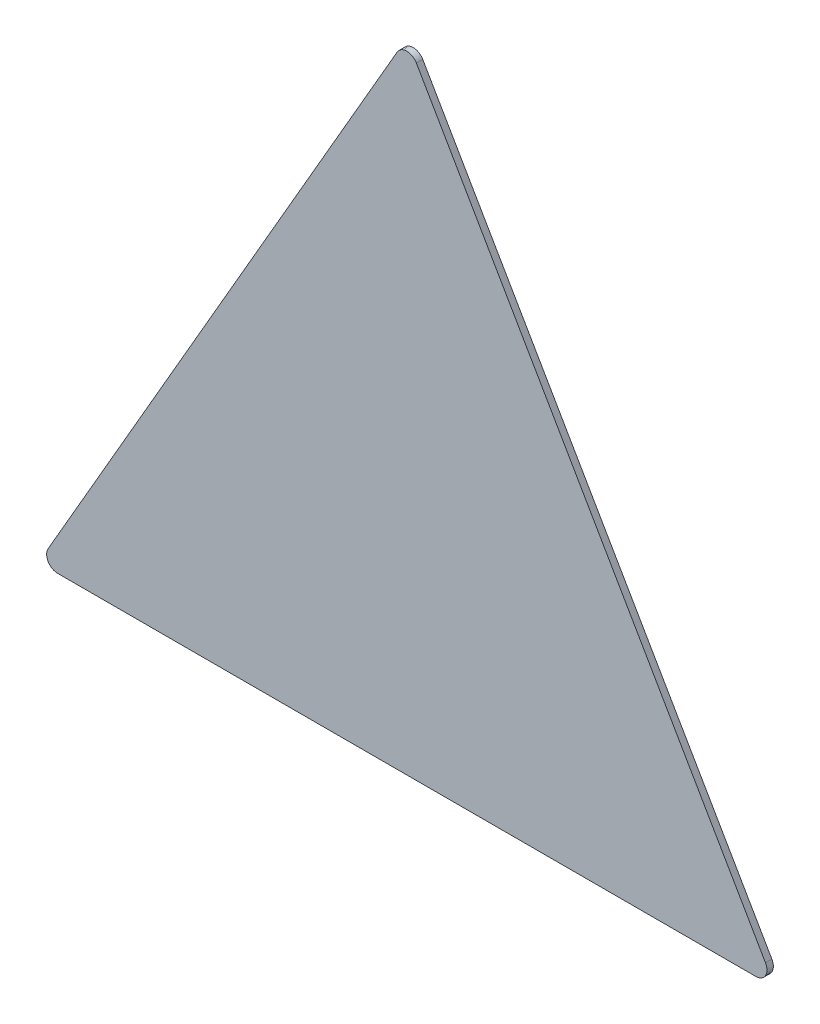
ISO-10303-21;
HEADER;
FILE_DESCRIPTION(('STEP AP214'),'2;1');
FILE_NAME('part.step','',(''),(''),'','','');
FILE_SCHEMA(('AUTOMOTIVE_DESIGN { 1 0 10303 214 1 1 1 1 }'));
ENDSEC;
DATA;
#1=APPLICATION_CONTEXT('core data for automotive mechanical design processes');
#2=APPLICATION_PROTOCOL_DEFINITION('international standard','automotive_design',2000,#1);
#3=PRODUCT_CONTEXT('',#1,'mechanical');
#4=PRODUCT('Part','Part','',(#3));
#5=PRODUCT_RELATED_PRODUCT_CATEGORY('part','',(#4));
#6=PRODUCT_DEFINITION_FORMATION('','',#4);
#7=PRODUCT_DEFINITION_CONTEXT('part definition',#1,'design');
#8=PRODUCT_DEFINITION('design','',#6,#7);
#9=PRODUCT_DEFINITION_SHAPE('','',#8);
#10=(LENGTH_UNIT() NAMED_UNIT(*) SI_UNIT(.MILLI.,.METRE.));
#11=(NAMED_UNIT(*) PLANE_ANGLE_UNIT() SI_UNIT($,.RADIAN.));
#12=(NAMED_UNIT(*) SI_UNIT($,.STERADIAN.) SOLID_ANGLE_UNIT());
#13=UNCERTAINTY_MEASURE_WITH_UNIT(LENGTH_MEASURE(1.E-05),#10,'distance_accuracy_value','');
#14=(GEOMETRIC_REPRESENTATION_CONTEXT(3) GLOBAL_UNCERTAINTY_ASSIGNED_CONTEXT((#13)) GLOBAL_UNIT_ASSIGNED_CONTEXT((#10,
#11,#12)) REPRESENTATION_CONTEXT('',''));
#15=CARTESIAN_POINT('',(0.,0.,0.));
#16=DIRECTION('',(0.,0.,1.));
#17=DIRECTION('',(1.,0.,0.));
#18=AXIS2_PLACEMENT_3D('',#15,#16,#17);
#19=CARTESIAN_POINT('',(103.141629659166,-93.104422444937,1.9));
#20=CARTESIAN_POINT('',(103.178852040873,-93.104422444937,1.9));
#21=CARTESIAN_POINT('',(103.216074422579,-93.104422444937,1.9));
#22=CARTESIAN_POINT('',(103.253291826511,-93.1041447887185,1.9));
#23=CARTESIAN_POINT('',(103.366142188296,-93.1016183909623,1.9));
#24=CARTESIAN_POINT('',(103.478855176732,-93.0914294172124,1.9));
#25=CARTESIAN_POINT('',(103.55423340692,-93.0817370029694,1.9));
#26=CARTESIAN_POINT('',(103.742579830233,-93.0517016000013,1.9));
#27=CARTESIAN_POINT('',(103.928445434177,-93.0109537048063,1.9));
#28=CARTESIAN_POINT('',(104.039054086677,-92.9822226272182,1.9));
#29=CARTESIAN_POINT('',(104.258635544711,-92.9152297759423,1.9));
#30=CARTESIAN_POINT('',(104.471505092383,-92.8282537042299,1.9));
#31=CARTESIAN_POINT('',(104.576539539421,-92.7797256700486,1.9));
#32=CARTESIAN_POINT('',(104.782119906057,-92.6735397423667,1.9));
#33=CARTESIAN_POINT('',(104.977626674108,-92.5500631139336,1.9));
#34=CARTESIAN_POINT('',(105.072620821996,-92.4841386635352,1.9));
#35=CARTESIAN_POINT('',(105.256608972513,-92.3441905683861,1.9));
#36=CARTESIAN_POINT('',(105.427633486552,-92.1885902405563,1.9));
#37=CARTESIAN_POINT('',(105.509695105328,-92.107093417081,1.9));
#38=CARTESIAN_POINT('',(105.666497608147,-91.9371392482291,1.9));
#39=CARTESIAN_POINT('',(105.807819725005,-91.754129630014,1.9));
#40=CARTESIAN_POINT('',(105.874440278277,-91.6596002585276,1.9));
#41=CARTESIAN_POINT('',(105.99925955717,-91.4649709907209,1.9));
#42=CARTESIAN_POINT('',(106.106553546095,-91.2601578730944,1.9));
#43=CARTESIAN_POINT('',(106.155695658159,-91.1554718891076,1.9));
#44=CARTESIAN_POINT('',(106.244722997683,-90.9420741453501,1.9));
#45=CARTESIAN_POINT('',(106.314742328373,-90.7216909991505,1.9));
#46=CARTESIAN_POINT('',(106.344915956849,-90.6100424727091,1.9));
#47=CARTESIAN_POINT('',(106.395423070742,-90.3844103076811,1.9));
#48=CARTESIAN_POINT('',(106.425913759874,-90.1552655074384,1.9));
#49=CARTESIAN_POINT('',(106.436155124557,-90.0400916614831,1.9));
#50=CARTESIAN_POINT('',(106.446630146773,-89.809094503844,1.9));
#51=CARTESIAN_POINT('',(106.437090259918,-89.5779052666268,1.9));
#52=CARTESIAN_POINT('',(106.42724369564,-89.4626212558664,1.9));
#53=CARTESIAN_POINT('',(106.397251538212,-89.2333917055278,1.9));
#54=CARTESIAN_POINT('',(106.346369748708,-89.0082736085243,1.9));
#55=CARTESIAN_POINT('',(106.316149398419,-88.896786507782,1.9));
#56=CARTESIAN_POINT('',(106.258554642843,-88.7128347268528,1.9));
#57=CARTESIAN_POINT('',(106.190144469002,-88.5321054920635,1.9));
#58=CARTESIAN_POINT('',(106.16058715988,-88.4607327796672,1.9));
#59=CARTESIAN_POINT('',(106.112267177822,-88.3556572445573,1.9));
#60=CARTESIAN_POINT('',(106.056929929708,-88.2544646014827,1.9));
#61=CARTESIAN_POINT('',(106.037964382852,-88.22102134209,1.9));
#62=CARTESIAN_POINT('',(106.018738937252,-88.1877218935135,1.9));
#63=CARTESIAN_POINT('',(105.999013491653,-88.1535564195332,1.9));
#64=CARTESIAN_POINT('',(105.998513491653,-88.1526903941294,1.9));
#65=CARTESIAN_POINT('',(105.998013491653,-88.1518243687256,1.9));
#66=CARTESIAN_POINT('',(105.997513491653,-88.1509583433218,1.9));
#67=CARTESIAN_POINT('',(105.997013491653,-88.1500923179181,1.9));
#68=B_SPLINE_CURVE_WITH_KNOTS('',5,(#19,#20,#21,#22,#23,#24,#25,#26,#27,#28,#29,#30,#31,#32,#33,
#34,#35,#36,#37,#38,#39,#40,#41,#42,#43,#44,#45,#46,#47,#48,#49,#50,#51,#52,#53,#54,#55,#56,#57,
#58,#59,#60,#61,#62,#63,#64,#65,#66,#67),.UNSPECIFIED.,.F.,.F.,(6,3,3,3,3,3,3,3,3,3,3,3,3,3,4,
6),(0.,0.0269425552336238,0.081716893793698,0.164323015645542,0.247818365520855,
0.331313715396167,0.41480906527148,0.498304415146791,0.581799765022101,0.665295114897413,
0.748790464772725,0.832285814648038,0.915781164523349,0.971444731106889,0.999276514398659,1.),.UNSPECIFIED.);
#69=DIRECTION('',(0.,0.,-1.));
#70=VECTOR('',#69,1.);
#71=SURFACE_OF_LINEAR_EXTRUSION('',#68,#70);
#72=CARTESIAN_POINT('',(103.141629659166,-93.104422444937,0.));
#73=CARTESIAN_POINT('',(103.178852040873,-93.104422444937,0.));
#74=CARTESIAN_POINT('',(103.216074422579,-93.104422444937,0.));
#75=CARTESIAN_POINT('',(103.253291826511,-93.1041447887185,0.));
#76=CARTESIAN_POINT('',(103.366142188296,-93.1016183909623,0.));
#77=CARTESIAN_POINT('',(103.478855176732,-93.0914294172124,0.));
#78=CARTESIAN_POINT('',(103.55423340692,-93.0817370029694,0.));
#79=CARTESIAN_POINT('',(103.742579830233,-93.0517016000013,0.));
#80=CARTESIAN_POINT('',(103.928445434177,-93.0109537048063,0.));
#81=CARTESIAN_POINT('',(104.039054086677,-92.9822226272182,0.));
#82=CARTESIAN_POINT('',(104.258635544711,-92.9152297759423,0.));
#83=CARTESIAN_POINT('',(104.471505092383,-92.8282537042299,0.));
#84=CARTESIAN_POINT('',(104.576539539421,-92.7797256700486,0.));
#85=CARTESIAN_POINT('',(104.782119906057,-92.6735397423667,0.));
#86=CARTESIAN_POINT('',(104.977626674108,-92.5500631139336,0.));
#87=CARTESIAN_POINT('',(105.072620821996,-92.4841386635352,0.));
#88=CARTESIAN_POINT('',(105.256608972513,-92.3441905683861,0.));
#89=CARTESIAN_POINT('',(105.427633486552,-92.1885902405563,0.));
#90=CARTESIAN_POINT('',(105.509695105328,-92.107093417081,0.));
#91=CARTESIAN_POINT('',(105.666497608147,-91.9371392482291,0.));
#92=CARTESIAN_POINT('',(105.807819725005,-91.754129630014,0.));
#93=CARTESIAN_POINT('',(105.874440278277,-91.6596002585276,0.));
#94=CARTESIAN_POINT('',(105.99925955717,-91.4649709907209,0.));
#95=CARTESIAN_POINT('',(106.106553546095,-91.2601578730944,0.));
#96=CARTESIAN_POINT('',(106.155695658159,-91.1554718891076,0.));
#97=CARTESIAN_POINT('',(106.244722997683,-90.9420741453501,0.));
#98=CARTESIAN_POINT('',(106.314742328373,-90.7216909991505,0.));
#99=CARTESIAN_POINT('',(106.344915956849,-90.6100424727091,0.));
#100=CARTESIAN_POINT('',(106.395423070742,-90.3844103076811,0.));
#101=CARTESIAN_POINT('',(106.425913759874,-90.1552655074384,0.));
#102=CARTESIAN_POINT('',(106.436155124557,-90.0400916614831,0.));
#103=CARTESIAN_POINT('',(106.446630146773,-89.809094503844,0.));
#104=CARTESIAN_POINT('',(106.437090259918,-89.5779052666268,0.));
#105=CARTESIAN_POINT('',(106.42724369564,-89.4626212558664,0.));
#106=CARTESIAN_POINT('',(106.397251538212,-89.2333917055278,0.));
#107=CARTESIAN_POINT('',(106.346369748708,-89.0082736085243,0.));
#108=CARTESIAN_POINT('',(106.316149398419,-88.896786507782,0.));
#109=CARTESIAN_POINT('',(106.258554642843,-88.7128347268528,0.));
#110=CARTESIAN_POINT('',(106.190144469002,-88.5321054920635,0.));
#111=CARTESIAN_POINT('',(106.16058715988,-88.4607327796672,0.));
#112=CARTESIAN_POINT('',(106.112267177822,-88.3556572445573,0.));
#113=CARTESIAN_POINT('',(106.056929929708,-88.2544646014827,0.));
#114=CARTESIAN_POINT('',(106.037964382852,-88.22102134209,0.));
#115=CARTESIAN_POINT('',(106.018738937252,-88.1877218935135,0.));
#116=CARTESIAN_POINT('',(105.999013491653,-88.1535564195332,0.));
#117=CARTESIAN_POINT('',(105.998513491653,-88.1526903941294,0.));
#118=CARTESIAN_POINT('',(105.998013491653,-88.1518243687256,0.));
#119=CARTESIAN_POINT('',(105.997513491653,-88.1509583433218,0.));
#120=CARTESIAN_POINT('',(105.997013491653,-88.1500923179181,0.));
#121=B_SPLINE_CURVE_WITH_KNOTS('',5,(#72,#73,#74,#75,#76,#77,#78,#79,#80,#81,#82,#83,#84,#85,
#86,#87,#88,#89,#90,#91,#92,#93,#94,#95,#96,#97,#98,#99,#100,#101,#102,#103,#104,#105,#106,#107,
#108,#109,#110,#111,#112,#113,#114,#115,#116,#117,#118,#119,#120),.UNSPECIFIED.,.F.,.F.,(6,3,3,
3,3,3,3,3,3,3,3,3,3,3,4,6),(0.,0.0269425552336238,0.081716893793698,0.164323015645542,
0.247818365520855,0.331313715396167,0.41480906527148,0.498304415146791,0.581799765022101,
0.665295114897413,0.748790464772725,0.832285814648038,0.915781164523349,0.971444731106889,
0.999276514398659,1.),.UNSPECIFIED.);
#122=CARTESIAN_POINT('',(103.141629659166,-93.104422444937,0.));
#123=VERTEX_POINT('',#122);
#124=CARTESIAN_POINT('',(105.997013491653,-88.1500923179181,0.));
#125=VERTEX_POINT('',#124);
#126=EDGE_CURVE('E168',#123,#125,#121,.T.);
#127=ORIENTED_EDGE('',*,*,#126,.T.);
#128=DIRECTION('',(0.,0.,-1.));
#129=VECTOR('',#128,1.);
#130=CARTESIAN_POINT('',(105.997013491653,-88.1500923179181,1.9));
#131=LINE('',#130,#129);
#132=CARTESIAN_POINT('',(105.997013491653,-88.1500923179181,1.9));
#133=VERTEX_POINT('',#132);
#134=EDGE_CURVE('E11',#133,#125,#131,.T.);
#135=ORIENTED_EDGE('',*,*,#134,.F.);
#136=CARTESIAN_POINT('',(103.141629659166,-93.104422444937,1.9));
#137=VERTEX_POINT('',#136);
#138=EDGE_CURVE('E143',#137,#133,#68,.T.);
#139=ORIENTED_EDGE('',*,*,#138,.F.);
#140=DIRECTION('',(0.,0.,-1.));
#141=VECTOR('',#140,1.);
#142=CARTESIAN_POINT('',(103.141629659166,-93.104422444937,1.9));
#143=LINE('',#142,#141);
#144=EDGE_CURVE('E114',#137,#123,#143,.T.);
#145=ORIENTED_EDGE('',*,*,#144,.T.);
#146=EDGE_LOOP('',(#127,#135,#139,#145));
#147=FACE_BOUND('',#146,.T.);
#148=ADVANCED_FACE('F33',(#147),#71,.F.);
#149=CARTESIAN_POINT('',(2.15976752949695,91.7012934065619,1.9));
#150=DIRECTION('',(-0.866025403784439,-0.5,0.));
#151=DIRECTION('',(0.5,-0.866025403784439,0.));
#152=AXIS2_PLACEMENT_3D('',#149,#150,#151);
#153=PLANE('',#152);
#154=DIRECTION('',(-0.5,0.866025403784439,0.));
#155=VECTOR('',#154,1.);
#156=CARTESIAN_POINT('',(2.15976752949695,91.7012934065619,0.));
#157=LINE('',#156,#155);
#158=CARTESIAN_POINT('',(2.15976752949695,91.7012934065619,0.));
#159=VERTEX_POINT('',#158);
#160=EDGE_CURVE('E166',#125,#159,#157,.T.);
#161=ORIENTED_EDGE('',*,*,#160,.T.);
#162=DIRECTION('',(0.,0.,-1.));
#163=VECTOR('',#162,1.);
#164=CARTESIAN_POINT('',(2.15976752949695,91.7012934065619,1.9));
#165=LINE('',#164,#163);
#166=CARTESIAN_POINT('',(2.15976752949695,91.7012934065619,1.9));
#167=VERTEX_POINT('',#166);
#168=EDGE_CURVE('E42',#167,#159,#165,.T.);
#169=ORIENTED_EDGE('',*,*,#168,.F.);
#170=DIRECTION('',(-0.5,0.866025403784439,0.));
#171=VECTOR('',#170,1.);
#172=CARTESIAN_POINT('',(2.15976752949695,91.7012934065619,1.9));
#173=LINE('',#172,#171);
#174=EDGE_CURVE('E87',#133,#167,#173,.T.);
#175=ORIENTED_EDGE('',*,*,#174,.F.);
#176=ORIENTED_EDGE('',*,*,#134,.T.);
#177=EDGE_LOOP('',(#161,#169,#175,#176));
#178=FACE_BOUND('',#177,.T.);
#179=ADVANCED_FACE('F134',(#178),#153,.F.);
#180=CARTESIAN_POINT('',(2.15976752949695,91.7012934065619,1.9));
#181=CARTESIAN_POINT('',(2.14115633864388,91.7335289347087,1.9));
#182=CARTESIAN_POINT('',(2.12254514779086,91.7657644628554,1.9));
#183=CARTESIAN_POINT('',(2.10369598848564,91.797856852015,1.9));
#184=CARTESIAN_POINT('',(2.04508288295605,91.8943249332692,1.9));
#185=CARTESIAN_POINT('',(1.97990247863215,91.9868427577163,1.9));
#186=CARTESIAN_POINT('',(1.93381948657908,92.047276012831,1.9));
#187=CARTESIAN_POINT('',(1.81363485293885,92.1953710986491,1.9));
#188=CARTESIAN_POINT('',(1.68541333857723,92.3359614857568,1.9));
#189=CARTESIAN_POINT('',(1.60522716925798,92.4173858499059,1.9));
#190=CARTESIAN_POINT('',(1.43741892916424,92.574052545125,1.9));
#191=CARTESIAN_POINT('',(1.25566066770396,92.7149149452449,1.9));
#192=CARTESIAN_POINT('',(1.16111693378854,92.7816134275611,1.9));
#193=CARTESIAN_POINT('',(0.966367039573238,92.9065582837469,1.9));
#194=CARTESIAN_POINT('',(0.761679758551176,93.014133797274,1.9));
#195=CARTESIAN_POINT('',(0.657090435831725,93.0634389173564,1.9));
#196=CARTESIAN_POINT('',(0.443897754962377,93.1528032821257,1.9));
#197=CARTESIAN_POINT('',(0.223631661205309,93.223114692038,1.9));
#198=CARTESIAN_POINT('',(0.112022532359918,93.2534337268361,1.9));
#199=CARTESIAN_POINT('',(-0.113563346754156,93.3042515932282,1.9));
#200=CARTESIAN_POINT('',(-0.34271538369452,93.3351353274366,1.9));
#201=CARTESIAN_POINT('',(-0.457890497441374,93.345565733241,1.9));
#202=CARTESIAN_POINT('',(-0.688854027128696,93.3563477657415,1.9));
#203=CARTESIAN_POINT('',(-0.919874384483771,93.3468605270101,1.9));
#204=CARTESIAN_POINT('',(-1.03510616206877,93.3370758524601,1.9));
#205=CARTESIAN_POINT('',(-1.26442769903467,93.3074769182398,1.9));
#206=CARTESIAN_POINT('',(-1.49029476755457,93.2579238642737,1.9));
#207=CARTESIAN_POINT('',(-1.60207204198599,93.2282307298377,1.9));
#208=CARTESIAN_POINT('',(-1.82272878575761,93.159155091027,1.9));
#209=CARTESIAN_POINT('',(-2.03641934847879,93.0709884022727,1.9));
#210=CARTESIAN_POINT('',(-2.14128350726923,93.0222707612801,1.9));
#211=CARTESIAN_POINT('',(-2.34657042509464,92.9158438178047,1.9));
#212=CARTESIAN_POINT('',(-2.542016234179,92.7919874148308,1.9));
#213=CARTESIAN_POINT('',(-2.63693183400827,92.7258180346452,1.9));
#214=CARTESIAN_POINT('',(-2.82045436918577,92.5852292892292,1.9));
#215=CARTESIAN_POINT('',(-2.98997146529063,92.4286053184274,1.9));
#216=CARTESIAN_POINT('',(-3.07141195158315,92.3466901769944,1.9));
#217=CARTESIAN_POINT('',(-3.20192148915107,92.204835765076,1.9));
#218=CARTESIAN_POINT('',(-3.32423251076475,92.0552261992582,1.9));
#219=CARTESIAN_POINT('',(-3.3712644382758,91.9939424624927,1.9));
#220=CARTESIAN_POINT('',(-3.43810252996811,91.8995583629651,1.9));
#221=CARTESIAN_POINT('',(-3.49806930549013,91.8010385787859,1.9));
#222=CARTESIAN_POINT('',(-3.51754924428119,91.767892303715,1.9));
#223=CARTESIAN_POINT('',(-3.53677468988073,91.7345928551385,1.9));
#224=CARTESIAN_POINT('',(-3.55600013548029,91.7012934065619,1.9));
#225=B_SPLINE_CURVE_WITH_KNOTS('',5,(#180,#181,#182,#183,#184,#185,#186,#187,#188,#189,#190,
#191,#192,#193,#194,#195,#196,#197,#198,#199,#200,#201,#202,#203,#204,#205,#206,#207,#208,#209,
#210,#211,#212,#213,#214,#215,#216,#217,#218,#219,#220,#221,#222,#223,#224),.UNSPECIFIED.,.F.,
.F.,(6,3,3,3,3,3,3,3,3,3,3,3,3,3,6),(0.,0.0269620618960812,0.0817760575909172,0.164441987049619,
0.247997788341216,0.331553589632814,0.415109390924412,0.498665192216013,0.582220993507613,
0.665776794799211,0.749332596090809,0.832888397382406,0.916444198674008,0.972148066201743,1.),.UNSPECIFIED.);
#226=DIRECTION('',(0.,0.,-1.));
#227=VECTOR('',#226,1.);
#228=SURFACE_OF_LINEAR_EXTRUSION('',#225,#227);
#229=CARTESIAN_POINT('',(2.15976752949695,91.7012934065619,0.));
#230=CARTESIAN_POINT('',(2.14115633864388,91.7335289347087,0.));
#231=CARTESIAN_POINT('',(2.12254514779086,91.7657644628554,0.));
#232=CARTESIAN_POINT('',(2.10369598848564,91.797856852015,0.));
#233=CARTESIAN_POINT('',(2.04508288295605,91.8943249332692,0.));
#234=CARTESIAN_POINT('',(1.97990247863215,91.9868427577163,0.));
#235=CARTESIAN_POINT('',(1.93381948657908,92.047276012831,0.));
#236=CARTESIAN_POINT('',(1.81363485293885,92.1953710986491,0.));
#237=CARTESIAN_POINT('',(1.68541333857723,92.3359614857568,0.));
#238=CARTESIAN_POINT('',(1.60522716925798,92.4173858499059,0.));
#239=CARTESIAN_POINT('',(1.43741892916424,92.574052545125,0.));
#240=CARTESIAN_POINT('',(1.25566066770396,92.7149149452449,0.));
#241=CARTESIAN_POINT('',(1.16111693378854,92.7816134275611,0.));
#242=CARTESIAN_POINT('',(0.966367039573238,92.9065582837469,0.));
#243=CARTESIAN_POINT('',(0.761679758551176,93.014133797274,0.));
#244=CARTESIAN_POINT('',(0.657090435831725,93.0634389173564,0.));
#245=CARTESIAN_POINT('',(0.443897754962377,93.1528032821257,0.));
#246=CARTESIAN_POINT('',(0.223631661205309,93.223114692038,0.));
#247=CARTESIAN_POINT('',(0.112022532359918,93.2534337268361,0.));
#248=CARTESIAN_POINT('',(-0.113563346754156,93.3042515932282,0.));
#249=CARTESIAN_POINT('',(-0.34271538369452,93.3351353274366,0.));
#250=CARTESIAN_POINT('',(-0.457890497441374,93.345565733241,0.));
#251=CARTESIAN_POINT('',(-0.688854027128696,93.3563477657415,0.));
#252=CARTESIAN_POINT('',(-0.919874384483771,93.3468605270101,0.));
#253=CARTESIAN_POINT('',(-1.03510616206877,93.3370758524601,0.));
#254=CARTESIAN_POINT('',(-1.26442769903467,93.3074769182398,0.));
#255=CARTESIAN_POINT('',(-1.49029476755457,93.2579238642737,0.));
#256=CARTESIAN_POINT('',(-1.60207204198599,93.2282307298377,0.));
#257=CARTESIAN_POINT('',(-1.82272878575761,93.159155091027,0.));
#258=CARTESIAN_POINT('',(-2.03641934847879,93.0709884022727,0.));
#259=CARTESIAN_POINT('',(-2.14128350726923,93.0222707612801,0.));
#260=CARTESIAN_POINT('',(-2.34657042509464,92.9158438178047,0.));
#261=CARTESIAN_POINT('',(-2.542016234179,92.7919874148308,0.));
#262=CARTESIAN_POINT('',(-2.63693183400827,92.7258180346452,0.));
#263=CARTESIAN_POINT('',(-2.82045436918577,92.5852292892292,0.));
#264=CARTESIAN_POINT('',(-2.98997146529063,92.4286053184274,0.));
#265=CARTESIAN_POINT('',(-3.07141195158315,92.3466901769944,0.));
#266=CARTESIAN_POINT('',(-3.20192148915107,92.204835765076,0.));
#267=CARTESIAN_POINT('',(-3.32423251076475,92.0552261992582,0.));
#268=CARTESIAN_POINT('',(-3.3712644382758,91.9939424624927,0.));
#269=CARTESIAN_POINT('',(-3.43810252996811,91.8995583629651,0.));
#270=CARTESIAN_POINT('',(-3.49806930549013,91.8010385787859,0.));
#271=CARTESIAN_POINT('',(-3.51754924428119,91.767892303715,0.));
#272=CARTESIAN_POINT('',(-3.53677468988073,91.7345928551385,0.));
#273=CARTESIAN_POINT('',(-3.55600013548029,91.7012934065619,0.));
#274=B_SPLINE_CURVE_WITH_KNOTS('',5,(#229,#230,#231,#232,#233,#234,#235,#236,#237,#238,#239,
#240,#241,#242,#243,#244,#245,#246,#247,#248,#249,#250,#251,#252,#253,#254,#255,#256,#257,#258,
#259,#260,#261,#262,#263,#264,#265,#266,#267,#268,#269,#270,#271,#272,#273),.UNSPECIFIED.,.F.,
.F.,(6,3,3,3,3,3,3,3,3,3,3,3,3,3,6),(0.,0.0269620618960812,0.0817760575909172,0.164441987049619,
0.247997788341216,0.331553589632814,0.415109390924412,0.498665192216013,0.582220993507613,
0.665776794799211,0.749332596090809,0.832888397382406,0.916444198674008,0.972148066201743,1.),.UNSPECIFIED.);
#275=CARTESIAN_POINT('',(-3.55600013548029,91.7012934065619,0.));
#276=VERTEX_POINT('',#275);
#277=EDGE_CURVE('E162',#159,#276,#274,.T.);
#278=ORIENTED_EDGE('',*,*,#277,.T.);
#279=DIRECTION('',(0.,0.,-1.));
#280=VECTOR('',#279,1.);
#281=CARTESIAN_POINT('',(-3.55600013548029,91.7012934065619,1.9));
#282=LINE('',#281,#280);
#283=CARTESIAN_POINT('',(-3.55600013548029,91.7012934065619,1.9));
#284=VERTEX_POINT('',#283);
#285=EDGE_CURVE('E109',#284,#276,#282,.T.);
#286=ORIENTED_EDGE('',*,*,#285,.F.);
#287=EDGE_CURVE('E100',#167,#284,#225,.T.);
#288=ORIENTED_EDGE('',*,*,#287,.F.);
#289=ORIENTED_EDGE('',*,*,#168,.T.);
#290=EDGE_LOOP('',(#278,#286,#288,#289));
#291=FACE_BOUND('',#290,.T.);
#292=ADVANCED_FACE('F132',(#291),#228,.F.);
#293=CARTESIAN_POINT('',(-107.395746097612,-88.1544224448958,1.9));
#294=DIRECTION('',(0.866025403784439,-0.5,0.));
#295=DIRECTION('',(0.5,0.866025403784439,0.));
#296=AXIS2_PLACEMENT_3D('',#293,#294,#295);
#297=PLANE('',#296);
#298=DIRECTION('',(-0.5,-0.866025403784439,0.));
#299=VECTOR('',#298,1.);
#300=CARTESIAN_POINT('',(-107.395746097612,-88.1544224448958,0.));
#301=LINE('',#300,#299);
#302=CARTESIAN_POINT('',(-107.395746097612,-88.1544224448958,0.));
#303=VERTEX_POINT('',#302);
#304=EDGE_CURVE('E108',#276,#303,#301,.T.);
#305=ORIENTED_EDGE('',*,*,#304,.T.);
#306=DIRECTION('',(0.,0.,-1.));
#307=VECTOR('',#306,1.);
#308=CARTESIAN_POINT('',(-107.395746097612,-88.1544224448958,1.9));
#309=LINE('',#308,#307);
#310=CARTESIAN_POINT('',(-107.395746097612,-88.1544224448958,1.9));
#311=VERTEX_POINT('',#310);
#312=EDGE_CURVE('E105',#311,#303,#309,.T.);
#313=ORIENTED_EDGE('',*,*,#312,.F.);
#314=DIRECTION('',(-0.5,-0.866025403784439,0.));
#315=VECTOR('',#314,1.);
#316=CARTESIAN_POINT('',(-107.395746097612,-88.1544224448958,1.9));
#317=LINE('',#316,#315);
#318=EDGE_CURVE('E94',#284,#311,#317,.T.);
#319=ORIENTED_EDGE('',*,*,#318,.F.);
#320=ORIENTED_EDGE('',*,*,#285,.T.);
#321=EDGE_LOOP('',(#305,#313,#319,#320));
#322=FACE_BOUND('',#321,.T.);
#323=ADVANCED_FACE('F106',(#322),#297,.F.);
#324=CARTESIAN_POINT('',(-107.395746097612,-88.1544224448958,1.9));
#325=CARTESIAN_POINT('',(-107.414357288465,-88.1866579730426,1.9));
#326=CARTESIAN_POINT('',(-107.432968479318,-88.2188935011894,1.9));
#327=CARTESIAN_POINT('',(-107.451336723946,-88.2512635465675,1.9));
#328=CARTESIAN_POINT('',(-107.505573980202,-88.3502580255778,1.9));
#329=CARTESIAN_POINT('',(-107.553106564314,-88.4529648237749,1.9));
#330=CARTESIAN_POINT('',(-107.58240180245,-88.5230904931327,1.9));
#331=CARTESIAN_POINT('',(-107.650563592124,-88.7012209819187,1.9));
#332=CARTESIAN_POINT('',(-107.708207681706,-88.8825592642215,1.9));
#333=CARTESIAN_POINT('',(-107.738630164887,-88.9927147059586,1.9));
#334=CARTESIAN_POINT('',(-107.790403382827,-89.2163742524538,1.9));
#335=CARTESIAN_POINT('',(-107.821514669038,-89.444212724286,1.9));
#336=CARTESIAN_POINT('',(-107.83200538216,-89.5594392407836,1.9));
#337=CARTESIAN_POINT('',(-107.842835854582,-89.7905700246512,1.9));
#338=CARTESIAN_POINT('',(-107.83365534161,-90.0216221666114,1.9));
#339=CARTESIAN_POINT('',(-107.824060166779,-90.1368517370923,1.9));
#340=CARTESIAN_POINT('',(-107.794855636427,-90.3661641970107,1.9));
#341=CARTESIAN_POINT('',(-107.745614056709,-90.5920759347529,1.9));
#342=CARTESIAN_POINT('',(-107.716066546639,-90.7038917930262,1.9));
#343=CARTESIAN_POINT('',(-107.647283170344,-90.9246638282701,1.9));
#344=CARTESIAN_POINT('',(-107.559453250262,-91.1385571806936,1.9));
#345=CARTESIAN_POINT('',(-107.510898689787,-91.2435169579843,1.9));
#346=CARTESIAN_POINT('',(-107.404754438993,-91.4489282582916,1.9));
#347=CARTESIAN_POINT('',(-107.281028070562,-91.6442541371867,1.9));
#348=CARTESIAN_POINT('',(-107.214938405042,-91.7391554466235,1.9));
#349=CARTESIAN_POINT('',(-107.074644207599,-91.9229542561607,1.9));
#350=CARTESIAN_POINT('',(-106.918796469769,-92.0937843483942,1.9));
#351=CARTESIAN_POINT('',(-106.837192823814,-92.1757397403996,1.9));
#352=CARTESIAN_POINT('',(-106.667043193936,-92.3322962666169,1.9));
#353=CARTESIAN_POINT('',(-106.483843320346,-92.4732743781052,1.9));
#354=CARTESIAN_POINT('',(-106.389220526239,-92.5397305830679,1.9));
#355=CARTESIAN_POINT('',(-106.194408630629,-92.6643007972316,1.9));
#356=CARTESIAN_POINT('',(-105.989422934691,-92.7716336314749,1.9));
#357=CARTESIAN_POINT('',(-105.884660770583,-92.8207482620497,1.9));
#358=CARTESIAN_POINT('',(-105.671146077977,-92.9093890669724,1.9));
#359=CARTESIAN_POINT('',(-105.450747192369,-92.9778831931741,1.9));
#360=CARTESIAN_POINT('',(-105.339086355787,-93.0074551524833,1.9));
#361=CARTESIAN_POINT('',(-105.150982062643,-93.0495525214941,1.9));
#362=CARTESIAN_POINT('',(-104.960260867189,-93.0806721904654,1.9));
#363=CARTESIAN_POINT('',(-104.883671630555,-93.0907611660962,1.9));
#364=CARTESIAN_POINT('',(-104.768513556805,-93.1014526016785,1.9));
#365=CARTESIAN_POINT('',(-104.653209533169,-93.1041254605741,1.9));
#366=CARTESIAN_POINT('',(-104.614764047522,-93.1044224448958,1.9));
#367=CARTESIAN_POINT('',(-104.576313156323,-93.1044224448958,1.9));
#368=CARTESIAN_POINT('',(-104.537862265124,-93.1044224448958,1.9));
#369=B_SPLINE_CURVE_WITH_KNOTS('',5,(#324,#325,#326,#327,#328,#329,#330,#331,#332,#333,#334,
#335,#336,#337,#338,#339,#340,#341,#342,#343,#344,#345,#346,#347,#348,#349,#350,#351,#352,#353,
#354,#355,#356,#357,#358,#359,#360,#361,#362,#363,#364,#365,#366,#367,#368),.UNSPECIFIED.,.F.,
.F.,(6,3,3,3,3,3,3,3,3,3,3,3,3,3,6),(0.,0.0269620618960815,0.081776057590924,0.164441987049633,
0.247997788341232,0.331553589632831,0.41510939092443,0.49866519221603,0.582220993507628,
0.665776794799227,0.749332596090825,0.832888397382424,0.916444198674023,0.972148066201756,1.),.UNSPECIFIED.);
#370=DIRECTION('',(0.,0.,-1.));
#371=VECTOR('',#370,1.);
#372=SURFACE_OF_LINEAR_EXTRUSION('',#369,#371);
#373=CARTESIAN_POINT('',(-107.395746097612,-88.1544224448958,0.));
#374=CARTESIAN_POINT('',(-107.414357288465,-88.1866579730426,0.));
#375=CARTESIAN_POINT('',(-107.432968479318,-88.2188935011894,0.));
#376=CARTESIAN_POINT('',(-107.451336723946,-88.2512635465675,0.));
#377=CARTESIAN_POINT('',(-107.505573980202,-88.3502580255778,0.));
#378=CARTESIAN_POINT('',(-107.553106564314,-88.4529648237749,0.));
#379=CARTESIAN_POINT('',(-107.58240180245,-88.5230904931327,0.));
#380=CARTESIAN_POINT('',(-107.650563592124,-88.7012209819187,0.));
#381=CARTESIAN_POINT('',(-107.708207681706,-88.8825592642215,0.));
#382=CARTESIAN_POINT('',(-107.738630164887,-88.9927147059586,0.));
#383=CARTESIAN_POINT('',(-107.790403382827,-89.2163742524538,0.));
#384=CARTESIAN_POINT('',(-107.821514669038,-89.444212724286,0.));
#385=CARTESIAN_POINT('',(-107.83200538216,-89.5594392407836,0.));
#386=CARTESIAN_POINT('',(-107.842835854582,-89.7905700246512,0.));
#387=CARTESIAN_POINT('',(-107.83365534161,-90.0216221666114,0.));
#388=CARTESIAN_POINT('',(-107.824060166779,-90.1368517370923,0.));
#389=CARTESIAN_POINT('',(-107.794855636427,-90.3661641970107,0.));
#390=CARTESIAN_POINT('',(-107.745614056709,-90.5920759347529,0.));
#391=CARTESIAN_POINT('',(-107.716066546639,-90.7038917930262,0.));
#392=CARTESIAN_POINT('',(-107.647283170344,-90.9246638282701,0.));
#393=CARTESIAN_POINT('',(-107.559453250262,-91.1385571806936,0.));
#394=CARTESIAN_POINT('',(-107.510898689787,-91.2435169579843,0.));
#395=CARTESIAN_POINT('',(-107.404754438993,-91.4489282582916,0.));
#396=CARTESIAN_POINT('',(-107.281028070562,-91.6442541371867,0.));
#397=CARTESIAN_POINT('',(-107.214938405042,-91.7391554466235,0.));
#398=CARTESIAN_POINT('',(-107.074644207599,-91.9229542561607,0.));
#399=CARTESIAN_POINT('',(-106.918796469769,-92.0937843483942,0.));
#400=CARTESIAN_POINT('',(-106.837192823814,-92.1757397403996,0.));
#401=CARTESIAN_POINT('',(-106.667043193936,-92.3322962666169,0.));
#402=CARTESIAN_POINT('',(-106.483843320346,-92.4732743781052,0.));
#403=CARTESIAN_POINT('',(-106.389220526239,-92.5397305830679,0.));
#404=CARTESIAN_POINT('',(-106.194408630629,-92.6643007972316,0.));
#405=CARTESIAN_POINT('',(-105.989422934691,-92.7716336314749,0.));
#406=CARTESIAN_POINT('',(-105.884660770583,-92.8207482620497,0.));
#407=CARTESIAN_POINT('',(-105.671146077977,-92.9093890669724,0.));
#408=CARTESIAN_POINT('',(-105.450747192369,-92.9778831931741,0.));
#409=CARTESIAN_POINT('',(-105.339086355787,-93.0074551524833,0.));
#410=CARTESIAN_POINT('',(-105.150982062643,-93.0495525214941,0.));
#411=CARTESIAN_POINT('',(-104.960260867189,-93.0806721904654,0.));
#412=CARTESIAN_POINT('',(-104.883671630555,-93.0907611660962,0.));
#413=CARTESIAN_POINT('',(-104.768513556805,-93.1014526016785,0.));
#414=CARTESIAN_POINT('',(-104.653209533169,-93.1041254605741,0.));
#415=CARTESIAN_POINT('',(-104.614764047522,-93.1044224448958,0.));
#416=CARTESIAN_POINT('',(-104.576313156323,-93.1044224448958,0.));
#417=CARTESIAN_POINT('',(-104.537862265124,-93.1044224448958,0.));
#418=B_SPLINE_CURVE_WITH_KNOTS('',5,(#373,#374,#375,#376,#377,#378,#379,#380,#381,#382,#383,
#384,#385,#386,#387,#388,#389,#390,#391,#392,#393,#394,#395,#396,#397,#398,#399,#400,#401,#402,
#403,#404,#405,#406,#407,#408,#409,#410,#411,#412,#413,#414,#415,#416,#417),.UNSPECIFIED.,.F.,
.F.,(6,3,3,3,3,3,3,3,3,3,3,3,3,3,6),(0.,0.0269620618960815,0.081776057590924,0.164441987049633,
0.247997788341232,0.331553589632831,0.41510939092443,0.49866519221603,0.582220993507628,
0.665776794799227,0.749332596090825,0.832888397382424,0.916444198674023,0.972148066201756,1.),.UNSPECIFIED.);
#419=CARTESIAN_POINT('',(-104.537862265124,-93.1044224448958,0.));
#420=VERTEX_POINT('',#419);
#421=EDGE_CURVE('E73',#303,#420,#418,.T.);
#422=ORIENTED_EDGE('',*,*,#421,.T.);
#423=DIRECTION('',(0.,0.,-1.));
#424=VECTOR('',#423,1.);
#425=CARTESIAN_POINT('',(-104.537862265124,-93.1044224448958,1.9));
#426=LINE('',#425,#424);
#427=CARTESIAN_POINT('',(-104.537862265124,-93.1044224448958,1.9));
#428=VERTEX_POINT('',#427);
#429=EDGE_CURVE('E110',#428,#420,#426,.T.);
#430=ORIENTED_EDGE('',*,*,#429,.F.);
#431=EDGE_CURVE('E98',#311,#428,#369,.T.);
#432=ORIENTED_EDGE('',*,*,#431,.F.);
#433=ORIENTED_EDGE('',*,*,#312,.T.);
#434=EDGE_LOOP('',(#422,#430,#432,#433));
#435=FACE_BOUND('',#434,.T.);
#436=ADVANCED_FACE('F112',(#435),#372,.F.);
#437=CARTESIAN_POINT('',(103.141629659166,-93.104422444937,1.9));
#438=DIRECTION('',(1.9833096581635E-13,1.,0.));
#439=DIRECTION('',(-1.,1.9833096581635E-13,0.));
#440=AXIS2_PLACEMENT_3D('',#437,#438,#439);
#441=PLANE('',#440);
#442=DIRECTION('',(1.,-1.9833096581635E-13,0.));
#443=VECTOR('',#442,1.);
#444=CARTESIAN_POINT('',(103.141629659166,-93.104422444937,0.));
#445=LINE('',#444,#443);
#446=EDGE_CURVE('E79',#420,#123,#445,.T.);
#447=ORIENTED_EDGE('',*,*,#446,.T.);
#448=ORIENTED_EDGE('',*,*,#144,.F.);
#449=DIRECTION('',(1.,-1.9833096581635E-13,0.));
#450=VECTOR('',#449,1.);
#451=CARTESIAN_POINT('',(103.141629659166,-93.104422444937,1.9));
#452=LINE('',#451,#450);
#453=EDGE_CURVE('E50',#428,#137,#452,.T.);
#454=ORIENTED_EDGE('',*,*,#453,.F.);
#455=ORIENTED_EDGE('',*,*,#429,.T.);
#456=EDGE_LOOP('',(#447,#448,#454,#455));
#457=FACE_BOUND('',#456,.T.);
#458=ADVANCED_FACE('F128',(#457),#441,.F.);
#459=CARTESIAN_POINT('',(106.000752216712,-91.4522749376838,1.9));
#460=DIRECTION('',(0.,0.,1.));
#461=DIRECTION('',(1.,0.,0.));
#462=AXIS2_PLACEMENT_3D('',#459,#460,#461);
#463=PLANE('',#462);
#464=ORIENTED_EDGE('',*,*,#138,.T.);
#465=ORIENTED_EDGE('',*,*,#174,.T.);
#466=ORIENTED_EDGE('',*,*,#287,.T.);
#467=ORIENTED_EDGE('',*,*,#318,.T.);
#468=ORIENTED_EDGE('',*,*,#431,.T.);
#469=ORIENTED_EDGE('',*,*,#453,.T.);
#470=EDGE_LOOP('',(#464,#465,#466,#467,#468,#469));
#471=FACE_BOUND('',#470,.T.);
#472=ADVANCED_FACE('F96',(#471),#463,.T.);
#473=CARTESIAN_POINT('',(106.000752216712,-91.4522749376838,0.));
#474=DIRECTION('',(0.,0.,1.));
#475=DIRECTION('',(1.,0.,0.));
#476=AXIS2_PLACEMENT_3D('',#473,#474,#475);
#477=PLANE('',#476);
#478=ORIENTED_EDGE('',*,*,#126,.F.);
#479=ORIENTED_EDGE('',*,*,#446,.F.);
#480=ORIENTED_EDGE('',*,*,#421,.F.);
#481=ORIENTED_EDGE('',*,*,#304,.F.);
#482=ORIENTED_EDGE('',*,*,#277,.F.);
#483=ORIENTED_EDGE('',*,*,#160,.F.);
#484=EDGE_LOOP('',(#478,#479,#480,#481,#482,#483));
#485=FACE_BOUND('',#484,.T.);
#486=ADVANCED_FACE('F165',(#485),#477,.F.);
#487=CLOSED_SHELL('',(#148,#179,#292,#323,#436,#458,#472,#486));
#488=MANIFOLD_SOLID_BREP('B2',#487);
#489=ADVANCED_BREP_SHAPE_REPRESENTATION('',(#18,#488),#14);
#490=SHAPE_DEFINITION_REPRESENTATION(#9,#489);
ENDSEC;
END-ISO-10303-21;
